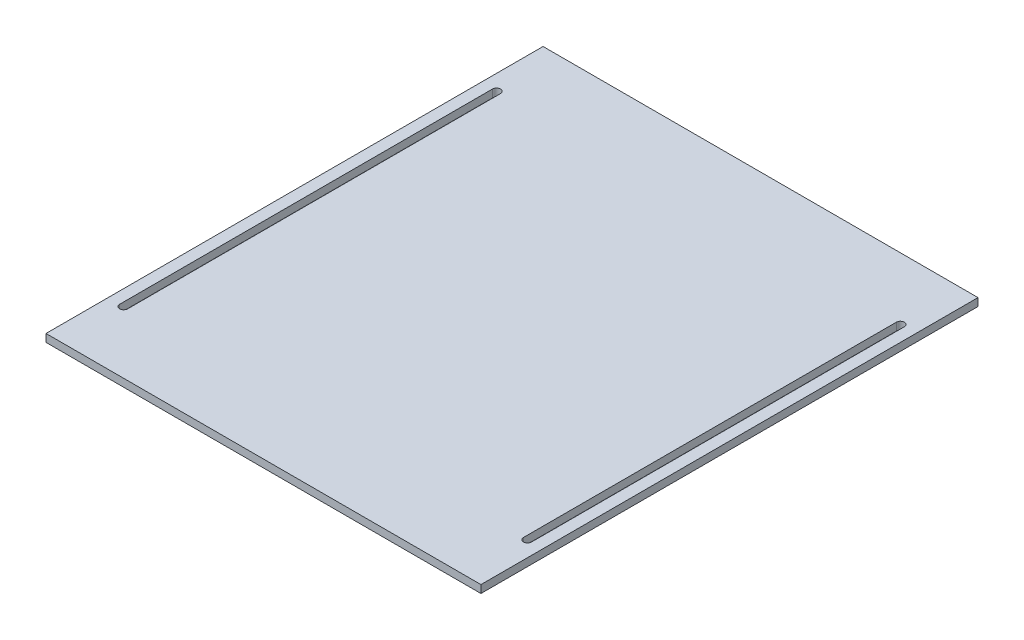
ISO-10303-21;
HEADER;
FILE_DESCRIPTION(('STEP AP214'),'2;1');
FILE_NAME('part.step','',(''),(''),'','','');
FILE_SCHEMA(('AUTOMOTIVE_DESIGN { 1 0 10303 214 1 1 1 1 }'));
ENDSEC;
DATA;
#1=APPLICATION_CONTEXT('core data for automotive mechanical design processes');
#2=APPLICATION_PROTOCOL_DEFINITION('international standard','automotive_design',2000,#1);
#3=PRODUCT_CONTEXT('',#1,'mechanical');
#4=PRODUCT('Part','Part','',(#3));
#5=PRODUCT_RELATED_PRODUCT_CATEGORY('part','',(#4));
#6=PRODUCT_DEFINITION_FORMATION('','',#4);
#7=PRODUCT_DEFINITION_CONTEXT('part definition',#1,'design');
#8=PRODUCT_DEFINITION('design','',#6,#7);
#9=PRODUCT_DEFINITION_SHAPE('','',#8);
#10=(LENGTH_UNIT() NAMED_UNIT(*) SI_UNIT(.MILLI.,.METRE.));
#11=(NAMED_UNIT(*) PLANE_ANGLE_UNIT() SI_UNIT($,.RADIAN.));
#12=(NAMED_UNIT(*) SI_UNIT($,.STERADIAN.) SOLID_ANGLE_UNIT());
#13=UNCERTAINTY_MEASURE_WITH_UNIT(LENGTH_MEASURE(1.E-05),#10,'distance_accuracy_value','');
#14=(GEOMETRIC_REPRESENTATION_CONTEXT(3) GLOBAL_UNCERTAINTY_ASSIGNED_CONTEXT((#13)) GLOBAL_UNIT_ASSIGNED_CONTEXT((#10,
#11,#12)) REPRESENTATION_CONTEXT('',''));
#15=CARTESIAN_POINT('',(0.,0.,0.));
#16=DIRECTION('',(0.,0.,1.));
#17=DIRECTION('',(1.,0.,0.));
#18=AXIS2_PLACEMENT_3D('',#15,#16,#17);
#19=CARTESIAN_POINT('',(0.,6.35,0.));
#20=DIRECTION('',(0.,-1.,0.));
#21=DIRECTION('',(0.,0.,-1.));
#22=AXIS2_PLACEMENT_3D('',#19,#20,#21);
#23=PLANE('',#22);
#24=DIRECTION('',(0.,0.,-1.));
#25=VECTOR('',#24,1.);
#26=CARTESIAN_POINT('',(-177.8,6.35,203.2));
#27=LINE('',#26,#25);
#28=CARTESIAN_POINT('',(-177.8,6.35,203.2));
#29=VERTEX_POINT('',#28);
#30=CARTESIAN_POINT('',(-177.8,6.35,-203.2));
#31=VERTEX_POINT('',#30);
#32=EDGE_CURVE('E221',#29,#31,#27,.T.);
#33=ORIENTED_EDGE('',*,*,#32,.F.);
#34=DIRECTION('',(1.,0.,0.));
#35=VECTOR('',#34,1.);
#36=CARTESIAN_POINT('',(-177.8,6.35,203.2));
#37=LINE('',#36,#35);
#38=CARTESIAN_POINT('',(177.8,6.35,203.2));
#39=VERTEX_POINT('',#38);
#40=EDGE_CURVE('E233',#29,#39,#37,.T.);
#41=ORIENTED_EDGE('',*,*,#40,.T.);
#42=DIRECTION('',(0.,0.,-1.));
#43=VECTOR('',#42,1.);
#44=CARTESIAN_POINT('',(177.8,6.35,203.2));
#45=LINE('',#44,#43);
#46=CARTESIAN_POINT('',(177.8,6.35,-203.2));
#47=VERTEX_POINT('',#46);
#48=EDGE_CURVE('E230',#39,#47,#45,.T.);
#49=ORIENTED_EDGE('',*,*,#48,.T.);
#50=DIRECTION('',(1.,0.,0.));
#51=VECTOR('',#50,1.);
#52=CARTESIAN_POINT('',(-177.8,6.35,-203.2));
#53=LINE('',#52,#51);
#54=EDGE_CURVE('E225',#31,#47,#53,.T.);
#55=ORIENTED_EDGE('',*,*,#54,.F.);
#56=EDGE_LOOP('',(#33,#41,#49,#55));
#57=FACE_BOUND('',#56,.T.);
#58=DIRECTION('',(0.,0.,1.));
#59=VECTOR('',#58,1.);
#60=CARTESIAN_POINT('',(-168.3639,6.35,-152.4));
#61=LINE('',#60,#59);
#62=CARTESIAN_POINT('',(-168.3639,6.35,-152.4));
#63=VERTEX_POINT('',#62);
#64=CARTESIAN_POINT('',(-168.3639,6.35,152.4));
#65=VERTEX_POINT('',#64);
#66=EDGE_CURVE('E197',#63,#65,#61,.T.);
#67=ORIENTED_EDGE('',*,*,#66,.F.);
#68=CARTESIAN_POINT('',(-165.1,6.35,-152.4));
#69=DIRECTION('',(0.,1.,0.));
#70=DIRECTION('',(0.,0.,1.));
#71=AXIS2_PLACEMENT_3D('',#68,#69,#70);
#72=CIRCLE('',#71,3.26390000000001);
#73=CARTESIAN_POINT('',(-161.8361,6.35,-152.4));
#74=VERTEX_POINT('',#73);
#75=EDGE_CURVE('E171',#74,#63,#72,.T.);
#76=ORIENTED_EDGE('',*,*,#75,.F.);
#77=DIRECTION('',(0.,0.,-1.));
#78=VECTOR('',#77,1.);
#79=CARTESIAN_POINT('',(-161.8361,6.35,-152.4));
#80=LINE('',#79,#78);
#81=CARTESIAN_POINT('',(-161.8361,6.35,152.4));
#82=VERTEX_POINT('',#81);
#83=EDGE_CURVE('E182',#82,#74,#80,.T.);
#84=ORIENTED_EDGE('',*,*,#83,.F.);
#85=CARTESIAN_POINT('',(-165.1,6.35,152.4));
#86=DIRECTION('',(0.,1.,0.));
#87=DIRECTION('',(0.,0.,1.));
#88=AXIS2_PLACEMENT_3D('',#85,#86,#87);
#89=CIRCLE('',#88,3.26390000000001);
#90=EDGE_CURVE('E201',#65,#82,#89,.T.);
#91=ORIENTED_EDGE('',*,*,#90,.F.);
#92=EDGE_LOOP('',(#67,#76,#84,#91));
#93=FACE_BOUND('',#92,.T.);
#94=CARTESIAN_POINT('',(165.1,6.35,-152.4));
#95=DIRECTION('',(0.,-1.,0.));
#96=DIRECTION('',(0.,0.,1.));
#97=AXIS2_PLACEMENT_3D('',#94,#95,#96);
#98=CIRCLE('',#97,3.26390000000001);
#99=CARTESIAN_POINT('',(161.8361,6.35,-152.4));
#100=VERTEX_POINT('',#99);
#101=CARTESIAN_POINT('',(168.3639,6.35,-152.4));
#102=VERTEX_POINT('',#101);
#103=EDGE_CURVE('E57',#100,#102,#98,.T.);
#104=ORIENTED_EDGE('',*,*,#103,.T.);
#105=DIRECTION('',(0.,0.,1.));
#106=VECTOR('',#105,1.);
#107=CARTESIAN_POINT('',(168.3639,6.35,-152.4));
#108=LINE('',#107,#106);
#109=CARTESIAN_POINT('',(168.3639,6.35,152.4));
#110=VERTEX_POINT('',#109);
#111=EDGE_CURVE('E149',#102,#110,#108,.T.);
#112=ORIENTED_EDGE('',*,*,#111,.T.);
#113=CARTESIAN_POINT('',(165.1,6.35,152.4));
#114=DIRECTION('',(0.,-1.,0.));
#115=DIRECTION('',(0.,0.,1.));
#116=AXIS2_PLACEMENT_3D('',#113,#114,#115);
#117=CIRCLE('',#116,3.26390000000001);
#118=CARTESIAN_POINT('',(161.8361,6.35,152.4));
#119=VERTEX_POINT('',#118);
#120=EDGE_CURVE('E153',#110,#119,#117,.T.);
#121=ORIENTED_EDGE('',*,*,#120,.T.);
#122=DIRECTION('',(0.,0.,-1.));
#123=VECTOR('',#122,1.);
#124=CARTESIAN_POINT('',(161.8361,6.35,-152.4));
#125=LINE('',#124,#123);
#126=EDGE_CURVE('E162',#119,#100,#125,.T.);
#127=ORIENTED_EDGE('',*,*,#126,.T.);
#128=EDGE_LOOP('',(#104,#112,#121,#127));
#129=FACE_BOUND('',#128,.T.);
#130=ADVANCED_FACE('F39',(#57,#93,#129),#23,.F.);
#131=CARTESIAN_POINT('',(0.,0.,0.));
#132=DIRECTION('',(0.,-1.,0.));
#133=DIRECTION('',(0.,0.,-1.));
#134=AXIS2_PLACEMENT_3D('',#131,#132,#133);
#135=PLANE('',#134);
#136=CARTESIAN_POINT('',(-165.1,0.,-152.4));
#137=DIRECTION('',(0.,1.,0.));
#138=DIRECTION('',(0.,0.,1.));
#139=AXIS2_PLACEMENT_3D('',#136,#137,#138);
#140=CIRCLE('',#139,3.26390000000001);
#141=CARTESIAN_POINT('',(-161.8361,0.,-152.4));
#142=VERTEX_POINT('',#141);
#143=CARTESIAN_POINT('',(-168.3639,0.,-152.4));
#144=VERTEX_POINT('',#143);
#145=EDGE_CURVE('E177',#142,#144,#140,.T.);
#146=ORIENTED_EDGE('',*,*,#145,.T.);
#147=DIRECTION('',(0.,0.,1.));
#148=VECTOR('',#147,1.);
#149=CARTESIAN_POINT('',(-168.3639,0.,-152.4));
#150=LINE('',#149,#148);
#151=CARTESIAN_POINT('',(-168.3639,0.,152.4));
#152=VERTEX_POINT('',#151);
#153=EDGE_CURVE('E181',#144,#152,#150,.T.);
#154=ORIENTED_EDGE('',*,*,#153,.T.);
#155=CARTESIAN_POINT('',(-165.1,0.,152.4));
#156=DIRECTION('',(0.,1.,0.));
#157=DIRECTION('',(0.,0.,1.));
#158=AXIS2_PLACEMENT_3D('',#155,#156,#157);
#159=CIRCLE('',#158,3.26390000000001);
#160=CARTESIAN_POINT('',(-161.8361,0.,152.4));
#161=VERTEX_POINT('',#160);
#162=EDGE_CURVE('E186',#152,#161,#159,.T.);
#163=ORIENTED_EDGE('',*,*,#162,.T.);
#164=DIRECTION('',(0.,0.,-1.));
#165=VECTOR('',#164,1.);
#166=CARTESIAN_POINT('',(-161.8361,0.,-152.4));
#167=LINE('',#166,#165);
#168=EDGE_CURVE('E190',#161,#142,#167,.T.);
#169=ORIENTED_EDGE('',*,*,#168,.T.);
#170=EDGE_LOOP('',(#146,#154,#163,#169));
#171=FACE_BOUND('',#170,.T.);
#172=DIRECTION('',(0.,0.,-1.));
#173=VECTOR('',#172,1.);
#174=CARTESIAN_POINT('',(-177.8,0.,203.2));
#175=LINE('',#174,#173);
#176=CARTESIAN_POINT('',(-177.8,0.,203.2));
#177=VERTEX_POINT('',#176);
#178=CARTESIAN_POINT('',(-177.8,0.,-203.2));
#179=VERTEX_POINT('',#178);
#180=EDGE_CURVE('E211',#177,#179,#175,.T.);
#181=ORIENTED_EDGE('',*,*,#180,.T.);
#182=DIRECTION('',(1.,0.,0.));
#183=VECTOR('',#182,1.);
#184=CARTESIAN_POINT('',(-177.8,0.,-203.2));
#185=LINE('',#184,#183);
#186=CARTESIAN_POINT('',(177.8,0.,-203.2));
#187=VERTEX_POINT('',#186);
#188=EDGE_CURVE('E239',#179,#187,#185,.T.);
#189=ORIENTED_EDGE('',*,*,#188,.T.);
#190=DIRECTION('',(0.,0.,-1.));
#191=VECTOR('',#190,1.);
#192=CARTESIAN_POINT('',(177.8,0.,203.2));
#193=LINE('',#192,#191);
#194=CARTESIAN_POINT('',(177.8,0.,203.2));
#195=VERTEX_POINT('',#194);
#196=EDGE_CURVE('E243',#195,#187,#193,.T.);
#197=ORIENTED_EDGE('',*,*,#196,.F.);
#198=DIRECTION('',(1.,0.,0.));
#199=VECTOR('',#198,1.);
#200=CARTESIAN_POINT('',(-177.8,0.,203.2));
#201=LINE('',#200,#199);
#202=EDGE_CURVE('E226',#177,#195,#201,.T.);
#203=ORIENTED_EDGE('',*,*,#202,.F.);
#204=EDGE_LOOP('',(#181,#189,#197,#203));
#205=FACE_BOUND('',#204,.T.);
#206=DIRECTION('',(0.,0.,1.));
#207=VECTOR('',#206,1.);
#208=CARTESIAN_POINT('',(168.3639,0.,-152.4));
#209=LINE('',#208,#207);
#210=CARTESIAN_POINT('',(168.3639,0.,-152.4));
#211=VERTEX_POINT('',#210);
#212=CARTESIAN_POINT('',(168.3639,0.,152.4));
#213=VERTEX_POINT('',#212);
#214=EDGE_CURVE('E144',#211,#213,#209,.T.);
#215=ORIENTED_EDGE('',*,*,#214,.F.);
#216=CARTESIAN_POINT('',(165.1,0.,-152.4));
#217=DIRECTION('',(0.,-1.,0.));
#218=DIRECTION('',(0.,0.,1.));
#219=AXIS2_PLACEMENT_3D('',#216,#217,#218);
#220=CIRCLE('',#219,3.26390000000001);
#221=CARTESIAN_POINT('',(161.8361,0.,-152.4));
#222=VERTEX_POINT('',#221);
#223=EDGE_CURVE('E139',#222,#211,#220,.T.);
#224=ORIENTED_EDGE('',*,*,#223,.F.);
#225=DIRECTION('',(0.,0.,-1.));
#226=VECTOR('',#225,1.);
#227=CARTESIAN_POINT('',(161.8361,0.,-152.4));
#228=LINE('',#227,#226);
#229=CARTESIAN_POINT('',(161.8361,0.,152.4));
#230=VERTEX_POINT('',#229);
#231=EDGE_CURVE('E130',#230,#222,#228,.T.);
#232=ORIENTED_EDGE('',*,*,#231,.F.);
#233=CARTESIAN_POINT('',(165.1,0.,152.4));
#234=DIRECTION('',(0.,-1.,0.));
#235=DIRECTION('',(0.,0.,1.));
#236=AXIS2_PLACEMENT_3D('',#233,#234,#235);
#237=CIRCLE('',#236,3.26390000000001);
#238=EDGE_CURVE('E138',#213,#230,#237,.T.);
#239=ORIENTED_EDGE('',*,*,#238,.F.);
#240=EDGE_LOOP('',(#215,#224,#232,#239));
#241=FACE_BOUND('',#240,.T.);
#242=ADVANCED_FACE('F147',(#171,#205,#241),#135,.T.);
#243=CARTESIAN_POINT('',(-177.8,6.35,203.2));
#244=DIRECTION('',(-1.,0.,0.));
#245=DIRECTION('',(0.,0.,1.));
#246=AXIS2_PLACEMENT_3D('',#243,#244,#245);
#247=PLANE('',#246);
#248=ORIENTED_EDGE('',*,*,#180,.F.);
#249=DIRECTION('',(0.,-1.,0.));
#250=VECTOR('',#249,1.);
#251=CARTESIAN_POINT('',(-177.8,6.35,203.2));
#252=LINE('',#251,#250);
#253=EDGE_CURVE('E11',#29,#177,#252,.T.);
#254=ORIENTED_EDGE('',*,*,#253,.F.);
#255=ORIENTED_EDGE('',*,*,#32,.T.);
#256=DIRECTION('',(0.,-1.,0.));
#257=VECTOR('',#256,1.);
#258=CARTESIAN_POINT('',(-177.8,6.35,-203.2));
#259=LINE('',#258,#257);
#260=EDGE_CURVE('E43',#31,#179,#259,.T.);
#261=ORIENTED_EDGE('',*,*,#260,.T.);
#262=EDGE_LOOP('',(#248,#254,#255,#261));
#263=FACE_BOUND('',#262,.T.);
#264=ADVANCED_FACE('F41',(#263),#247,.T.);
#265=CARTESIAN_POINT('',(-177.8,6.35,203.2));
#266=DIRECTION('',(0.,0.,-1.));
#267=DIRECTION('',(-1.,0.,0.));
#268=AXIS2_PLACEMENT_3D('',#265,#266,#267);
#269=PLANE('',#268);
#270=ORIENTED_EDGE('',*,*,#202,.T.);
#271=DIRECTION('',(0.,-1.,0.));
#272=VECTOR('',#271,1.);
#273=CARTESIAN_POINT('',(177.8,6.35,203.2));
#274=LINE('',#273,#272);
#275=EDGE_CURVE('E49',#39,#195,#274,.T.);
#276=ORIENTED_EDGE('',*,*,#275,.F.);
#277=ORIENTED_EDGE('',*,*,#40,.F.);
#278=ORIENTED_EDGE('',*,*,#253,.T.);
#279=EDGE_LOOP('',(#270,#276,#277,#278));
#280=FACE_BOUND('',#279,.T.);
#281=ADVANCED_FACE('F267',(#280),#269,.F.);
#282=CARTESIAN_POINT('',(177.8,6.35,203.2));
#283=DIRECTION('',(-1.,0.,0.));
#284=DIRECTION('',(0.,0.,1.));
#285=AXIS2_PLACEMENT_3D('',#282,#283,#284);
#286=PLANE('',#285);
#287=ORIENTED_EDGE('',*,*,#196,.T.);
#288=DIRECTION('',(0.,-1.,0.));
#289=VECTOR('',#288,1.);
#290=CARTESIAN_POINT('',(177.8,6.35,-203.2));
#291=LINE('',#290,#289);
#292=EDGE_CURVE('E251',#47,#187,#291,.T.);
#293=ORIENTED_EDGE('',*,*,#292,.F.);
#294=ORIENTED_EDGE('',*,*,#48,.F.);
#295=ORIENTED_EDGE('',*,*,#275,.T.);
#296=EDGE_LOOP('',(#287,#293,#294,#295));
#297=FACE_BOUND('',#296,.T.);
#298=ADVANCED_FACE('F271',(#297),#286,.F.);
#299=CARTESIAN_POINT('',(-177.8,6.35,-203.2));
#300=DIRECTION('',(0.,0.,-1.));
#301=DIRECTION('',(-1.,0.,0.));
#302=AXIS2_PLACEMENT_3D('',#299,#300,#301);
#303=PLANE('',#302);
#304=ORIENTED_EDGE('',*,*,#188,.F.);
#305=ORIENTED_EDGE('',*,*,#260,.F.);
#306=ORIENTED_EDGE('',*,*,#54,.T.);
#307=ORIENTED_EDGE('',*,*,#292,.T.);
#308=EDGE_LOOP('',(#304,#305,#306,#307));
#309=FACE_BOUND('',#308,.T.);
#310=ADVANCED_FACE('F261',(#309),#303,.T.);
#311=CARTESIAN_POINT('',(-165.1,0.,-152.4));
#312=DIRECTION('',(0.,1.,0.));
#313=DIRECTION('',(0.,0.,1.));
#314=AXIS2_PLACEMENT_3D('',#311,#312,#313);
#315=CYLINDRICAL_SURFACE('',#314,3.26390000000001);
#316=ORIENTED_EDGE('',*,*,#75,.T.);
#317=DIRECTION('',(0.,1.,0.));
#318=VECTOR('',#317,1.);
#319=CARTESIAN_POINT('',(-168.3639,0.,-152.4));
#320=LINE('',#319,#318);
#321=EDGE_CURVE('E194',#144,#63,#320,.T.);
#322=ORIENTED_EDGE('',*,*,#321,.F.);
#323=ORIENTED_EDGE('',*,*,#145,.F.);
#324=DIRECTION('',(0.,1.,0.));
#325=VECTOR('',#324,1.);
#326=CARTESIAN_POINT('',(-161.8361,0.,-152.4));
#327=LINE('',#326,#325);
#328=EDGE_CURVE('E208',#142,#74,#327,.T.);
#329=ORIENTED_EDGE('',*,*,#328,.T.);
#330=EDGE_LOOP('',(#316,#322,#323,#329));
#331=FACE_BOUND('',#330,.T.);
#332=ADVANCED_FACE('F302',(#331),#315,.F.);
#333=CARTESIAN_POINT('',(-161.8361,0.,-152.4));
#334=DIRECTION('',(1.,0.,0.));
#335=DIRECTION('',(0.,0.,-1.));
#336=AXIS2_PLACEMENT_3D('',#333,#334,#335);
#337=PLANE('',#336);
#338=ORIENTED_EDGE('',*,*,#83,.T.);
#339=ORIENTED_EDGE('',*,*,#328,.F.);
#340=ORIENTED_EDGE('',*,*,#168,.F.);
#341=DIRECTION('',(0.,1.,0.));
#342=VECTOR('',#341,1.);
#343=CARTESIAN_POINT('',(-161.8361,0.,152.4));
#344=LINE('',#343,#342);
#345=EDGE_CURVE('E212',#161,#82,#344,.T.);
#346=ORIENTED_EDGE('',*,*,#345,.T.);
#347=EDGE_LOOP('',(#338,#339,#340,#346));
#348=FACE_BOUND('',#347,.T.);
#349=ADVANCED_FACE('F298',(#348),#337,.F.);
#350=CARTESIAN_POINT('',(-165.1,0.,152.4));
#351=DIRECTION('',(0.,1.,0.));
#352=DIRECTION('',(0.,0.,1.));
#353=AXIS2_PLACEMENT_3D('',#350,#351,#352);
#354=CYLINDRICAL_SURFACE('',#353,3.26390000000001);
#355=ORIENTED_EDGE('',*,*,#90,.T.);
#356=ORIENTED_EDGE('',*,*,#345,.F.);
#357=ORIENTED_EDGE('',*,*,#162,.F.);
#358=DIRECTION('',(0.,1.,0.));
#359=VECTOR('',#358,1.);
#360=CARTESIAN_POINT('',(-168.3639,0.,152.4));
#361=LINE('',#360,#359);
#362=EDGE_CURVE('E215',#152,#65,#361,.T.);
#363=ORIENTED_EDGE('',*,*,#362,.T.);
#364=EDGE_LOOP('',(#355,#356,#357,#363));
#365=FACE_BOUND('',#364,.T.);
#366=ADVANCED_FACE('F301',(#365),#354,.F.);
#367=CARTESIAN_POINT('',(-168.3639,0.,-152.4));
#368=DIRECTION('',(-1.,0.,0.));
#369=DIRECTION('',(0.,0.,1.));
#370=AXIS2_PLACEMENT_3D('',#367,#368,#369);
#371=PLANE('',#370);
#372=ORIENTED_EDGE('',*,*,#66,.T.);
#373=ORIENTED_EDGE('',*,*,#362,.F.);
#374=ORIENTED_EDGE('',*,*,#153,.F.);
#375=ORIENTED_EDGE('',*,*,#321,.T.);
#376=EDGE_LOOP('',(#372,#373,#374,#375));
#377=FACE_BOUND('',#376,.T.);
#378=ADVANCED_FACE('F293',(#377),#371,.F.);
#379=CARTESIAN_POINT('',(165.1,0.,-152.4));
#380=DIRECTION('',(0.,1.,0.));
#381=DIRECTION('',(0.,0.,1.));
#382=AXIS2_PLACEMENT_3D('',#379,#380,#381);
#383=CYLINDRICAL_SURFACE('',#382,3.26390000000001);
#384=ORIENTED_EDGE('',*,*,#103,.F.);
#385=DIRECTION('',(0.,1.,0.));
#386=VECTOR('',#385,1.);
#387=CARTESIAN_POINT('',(161.8361,0.,-152.4));
#388=LINE('',#387,#386);
#389=EDGE_CURVE('E132',#222,#100,#388,.T.);
#390=ORIENTED_EDGE('',*,*,#389,.F.);
#391=ORIENTED_EDGE('',*,*,#223,.T.);
#392=DIRECTION('',(0.,1.,0.));
#393=VECTOR('',#392,1.);
#394=CARTESIAN_POINT('',(168.3639,0.,-152.4));
#395=LINE('',#394,#393);
#396=EDGE_CURVE('E168',#211,#102,#395,.T.);
#397=ORIENTED_EDGE('',*,*,#396,.T.);
#398=EDGE_LOOP('',(#384,#390,#391,#397));
#399=FACE_BOUND('',#398,.T.);
#400=ADVANCED_FACE('F141',(#399),#383,.F.);
#401=CARTESIAN_POINT('',(168.3639,0.,-152.4));
#402=DIRECTION('',(-1.,0.,0.));
#403=DIRECTION('',(0.,0.,1.));
#404=AXIS2_PLACEMENT_3D('',#401,#402,#403);
#405=PLANE('',#404);
#406=ORIENTED_EDGE('',*,*,#111,.F.);
#407=ORIENTED_EDGE('',*,*,#396,.F.);
#408=ORIENTED_EDGE('',*,*,#214,.T.);
#409=DIRECTION('',(0.,1.,0.));
#410=VECTOR('',#409,1.);
#411=CARTESIAN_POINT('',(168.3639,0.,152.4));
#412=LINE('',#411,#410);
#413=EDGE_CURVE('E172',#213,#110,#412,.T.);
#414=ORIENTED_EDGE('',*,*,#413,.T.);
#415=EDGE_LOOP('',(#406,#407,#408,#414));
#416=FACE_BOUND('',#415,.T.);
#417=ADVANCED_FACE('F285',(#416),#405,.T.);
#418=CARTESIAN_POINT('',(165.1,0.,152.4));
#419=DIRECTION('',(0.,1.,0.));
#420=DIRECTION('',(0.,0.,1.));
#421=AXIS2_PLACEMENT_3D('',#418,#419,#420);
#422=CYLINDRICAL_SURFACE('',#421,3.26390000000001);
#423=ORIENTED_EDGE('',*,*,#120,.F.);
#424=ORIENTED_EDGE('',*,*,#413,.F.);
#425=ORIENTED_EDGE('',*,*,#238,.T.);
#426=DIRECTION('',(0.,1.,0.));
#427=VECTOR('',#426,1.);
#428=CARTESIAN_POINT('',(161.8361,0.,152.4));
#429=LINE('',#428,#427);
#430=EDGE_CURVE('E65',#230,#119,#429,.T.);
#431=ORIENTED_EDGE('',*,*,#430,.T.);
#432=EDGE_LOOP('',(#423,#424,#425,#431));
#433=FACE_BOUND('',#432,.T.);
#434=ADVANCED_FACE('F283',(#433),#422,.F.);
#435=CARTESIAN_POINT('',(161.8361,0.,-152.4));
#436=DIRECTION('',(1.,0.,0.));
#437=DIRECTION('',(0.,0.,-1.));
#438=AXIS2_PLACEMENT_3D('',#435,#436,#437);
#439=PLANE('',#438);
#440=ORIENTED_EDGE('',*,*,#126,.F.);
#441=ORIENTED_EDGE('',*,*,#430,.F.);
#442=ORIENTED_EDGE('',*,*,#231,.T.);
#443=ORIENTED_EDGE('',*,*,#389,.T.);
#444=EDGE_LOOP('',(#440,#441,#442,#443));
#445=FACE_BOUND('',#444,.T.);
#446=ADVANCED_FACE('F131',(#445),#439,.T.);
#447=CLOSED_SHELL('',(#130,#242,#264,#281,#298,#310,#332,#349,#366,#378,#400,#417,#434,#446));
#448=MANIFOLD_SOLID_BREP('B2',#447);
#449=ADVANCED_BREP_SHAPE_REPRESENTATION('',(#18,#448),#14);
#450=SHAPE_DEFINITION_REPRESENTATION(#9,#449);
ENDSEC;
END-ISO-10303-21;
